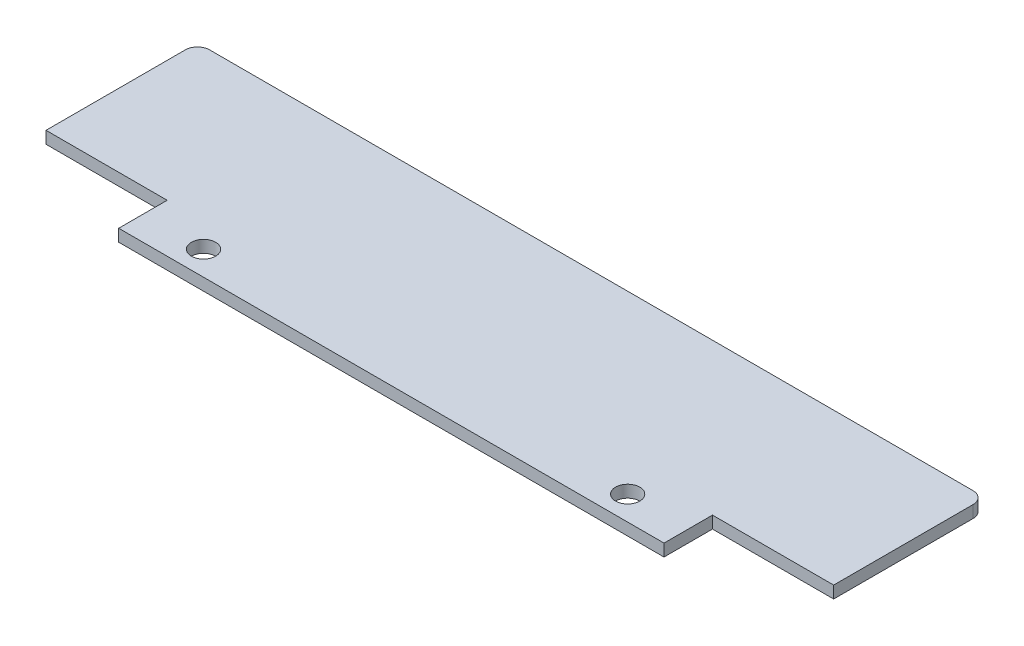
ISO-10303-21;
HEADER;
FILE_DESCRIPTION(('STEP AP214'),'2;1');
FILE_NAME('part.step','',(''),(''),'','','');
FILE_SCHEMA(('AUTOMOTIVE_DESIGN { 1 0 10303 214 1 1 1 1 }'));
ENDSEC;
DATA;
#1=APPLICATION_CONTEXT('core data for automotive mechanical design processes');
#2=APPLICATION_PROTOCOL_DEFINITION('international standard','automotive_design',2000,#1);
#3=PRODUCT_CONTEXT('',#1,'mechanical');
#4=PRODUCT('Part','Part','',(#3));
#5=PRODUCT_RELATED_PRODUCT_CATEGORY('part','',(#4));
#6=PRODUCT_DEFINITION_FORMATION('','',#4);
#7=PRODUCT_DEFINITION_CONTEXT('part definition',#1,'design');
#8=PRODUCT_DEFINITION('design','',#6,#7);
#9=PRODUCT_DEFINITION_SHAPE('','',#8);
#10=(LENGTH_UNIT() NAMED_UNIT(*) SI_UNIT(.MILLI.,.METRE.));
#11=(NAMED_UNIT(*) PLANE_ANGLE_UNIT() SI_UNIT($,.RADIAN.));
#12=(NAMED_UNIT(*) SI_UNIT($,.STERADIAN.) SOLID_ANGLE_UNIT());
#13=UNCERTAINTY_MEASURE_WITH_UNIT(LENGTH_MEASURE(1.E-05),#10,'distance_accuracy_value','');
#14=(GEOMETRIC_REPRESENTATION_CONTEXT(3) GLOBAL_UNCERTAINTY_ASSIGNED_CONTEXT((#13)) GLOBAL_UNIT_ASSIGNED_CONTEXT((#10,
#11,#12)) REPRESENTATION_CONTEXT('',''));
#15=CARTESIAN_POINT('',(0.,0.,0.));
#16=DIRECTION('',(0.,0.,1.));
#17=DIRECTION('',(1.,0.,0.));
#18=AXIS2_PLACEMENT_3D('',#15,#16,#17);
#19=CARTESIAN_POINT('',(0.,2.,0.));
#20=DIRECTION('',(0.,1.,0.));
#21=DIRECTION('',(0.,0.,1.));
#22=AXIS2_PLACEMENT_3D('',#19,#20,#21);
#23=PLANE('',#22);
#24=CARTESIAN_POINT('',(-35.,2.,16.5));
#25=DIRECTION('',(0.,1.,0.));
#26=DIRECTION('',(0.,0.,1.));
#27=AXIS2_PLACEMENT_3D('',#24,#25,#26);
#28=CIRCLE('',#27,2.);
#29=CARTESIAN_POINT('',(-35.,2.,18.5));
#30=VERTEX_POINT('',#29);
#31=EDGE_CURVE('E239',#30,#30,#28,.T.);
#32=ORIENTED_EDGE('',*,*,#31,.F.);
#33=EDGE_LOOP('',(#32));
#34=FACE_BOUND('',#33,.T.);
#35=DIRECTION('',(0.,0.,-1.));
#36=VECTOR('',#35,1.);
#37=CARTESIAN_POINT('',(65.,2.,-12.5));
#38=LINE('',#37,#36);
#39=CARTESIAN_POINT('',(65.,2.,12.5));
#40=VERTEX_POINT('',#39);
#41=CARTESIAN_POINT('',(65.,2.,-10.5));
#42=VERTEX_POINT('',#41);
#43=EDGE_CURVE('E176',#40,#42,#38,.T.);
#44=ORIENTED_EDGE('',*,*,#43,.T.);
#45=CARTESIAN_POINT('',(63.,2.,-10.5));
#46=DIRECTION('',(0.,1.,0.));
#47=DIRECTION('',(0.,0.,1.));
#48=AXIS2_PLACEMENT_3D('',#45,#46,#47);
#49=CIRCLE('',#48,2.);
#50=CARTESIAN_POINT('',(63.,2.,-12.5));
#51=VERTEX_POINT('',#50);
#52=EDGE_CURVE('E52',#42,#51,#49,.T.);
#53=ORIENTED_EDGE('',*,*,#52,.T.);
#54=DIRECTION('',(-1.,0.,0.));
#55=VECTOR('',#54,1.);
#56=CARTESIAN_POINT('',(-65.,2.,-12.5));
#57=LINE('',#56,#55);
#58=CARTESIAN_POINT('',(-63.,2.,-12.5));
#59=VERTEX_POINT('',#58);
#60=EDGE_CURVE('E175',#51,#59,#57,.T.);
#61=ORIENTED_EDGE('',*,*,#60,.T.);
#62=CARTESIAN_POINT('',(-63.,2.,-10.5));
#63=DIRECTION('',(0.,1.,0.));
#64=DIRECTION('',(0.,0.,1.));
#65=AXIS2_PLACEMENT_3D('',#62,#63,#64);
#66=CIRCLE('',#65,2.);
#67=CARTESIAN_POINT('',(-65.,2.,-10.5));
#68=VERTEX_POINT('',#67);
#69=EDGE_CURVE('E59',#59,#68,#66,.T.);
#70=ORIENTED_EDGE('',*,*,#69,.T.);
#71=DIRECTION('',(0.,0.,1.));
#72=VECTOR('',#71,1.);
#73=CARTESIAN_POINT('',(-65.,2.,-12.5));
#74=LINE('',#73,#72);
#75=CARTESIAN_POINT('',(-65.,2.,12.5));
#76=VERTEX_POINT('',#75);
#77=EDGE_CURVE('E139',#68,#76,#74,.T.);
#78=ORIENTED_EDGE('',*,*,#77,.T.);
#79=DIRECTION('',(1.,0.,0.));
#80=VECTOR('',#79,1.);
#81=CARTESIAN_POINT('',(-45.,2.,12.5));
#82=LINE('',#81,#80);
#83=CARTESIAN_POINT('',(-45.,2.,12.5));
#84=VERTEX_POINT('',#83);
#85=EDGE_CURVE('E135',#76,#84,#82,.T.);
#86=ORIENTED_EDGE('',*,*,#85,.T.);
#87=DIRECTION('',(0.,0.,1.));
#88=VECTOR('',#87,1.);
#89=CARTESIAN_POINT('',(-45.,2.,12.5));
#90=LINE('',#89,#88);
#91=CARTESIAN_POINT('',(-45.,2.,20.5));
#92=VERTEX_POINT('',#91);
#93=EDGE_CURVE('E124',#84,#92,#90,.T.);
#94=ORIENTED_EDGE('',*,*,#93,.T.);
#95=DIRECTION('',(1.,0.,0.));
#96=VECTOR('',#95,1.);
#97=CARTESIAN_POINT('',(-45.,2.,20.5));
#98=LINE('',#97,#96);
#99=CARTESIAN_POINT('',(45.,2.,20.5));
#100=VERTEX_POINT('',#99);
#101=EDGE_CURVE('E134',#92,#100,#98,.T.);
#102=ORIENTED_EDGE('',*,*,#101,.T.);
#103=DIRECTION('',(0.,0.,-1.));
#104=VECTOR('',#103,1.);
#105=CARTESIAN_POINT('',(45.,2.,20.5));
#106=LINE('',#105,#104);
#107=CARTESIAN_POINT('',(45.,2.,12.5));
#108=VERTEX_POINT('',#107);
#109=EDGE_CURVE('E226',#100,#108,#106,.T.);
#110=ORIENTED_EDGE('',*,*,#109,.T.);
#111=DIRECTION('',(1.,0.,0.));
#112=VECTOR('',#111,1.);
#113=CARTESIAN_POINT('',(65.,2.,12.5));
#114=LINE('',#113,#112);
#115=EDGE_CURVE('E244',#108,#40,#114,.T.);
#116=ORIENTED_EDGE('',*,*,#115,.T.);
#117=EDGE_LOOP('',(#44,#53,#61,#70,#78,#86,#94,#102,#110,#116));
#118=FACE_BOUND('',#117,.T.);
#119=CARTESIAN_POINT('',(35.,2.,16.5));
#120=DIRECTION('',(0.,1.,0.));
#121=DIRECTION('',(0.,0.,1.));
#122=AXIS2_PLACEMENT_3D('',#119,#120,#121);
#123=CIRCLE('',#122,2.);
#124=CARTESIAN_POINT('',(35.,2.,18.5));
#125=VERTEX_POINT('',#124);
#126=EDGE_CURVE('E255',#125,#125,#123,.T.);
#127=ORIENTED_EDGE('',*,*,#126,.F.);
#128=EDGE_LOOP('',(#127));
#129=FACE_BOUND('',#128,.T.);
#130=ADVANCED_FACE('F43',(#34,#118,#129),#23,.T.);
#131=CARTESIAN_POINT('',(0.,0.,0.));
#132=DIRECTION('',(0.,1.,0.));
#133=DIRECTION('',(0.,0.,1.));
#134=AXIS2_PLACEMENT_3D('',#131,#132,#133);
#135=PLANE('',#134);
#136=DIRECTION('',(-1.,0.,0.));
#137=VECTOR('',#136,1.);
#138=CARTESIAN_POINT('',(-65.,0.,-12.5));
#139=LINE('',#138,#137);
#140=CARTESIAN_POINT('',(63.,0.,-12.5));
#141=VERTEX_POINT('',#140);
#142=CARTESIAN_POINT('',(-63.,0.,-12.5));
#143=VERTEX_POINT('',#142);
#144=EDGE_CURVE('E193',#141,#143,#139,.T.);
#145=ORIENTED_EDGE('',*,*,#144,.F.);
#146=CARTESIAN_POINT('',(63.,0.,-10.5));
#147=DIRECTION('',(0.,1.,0.));
#148=DIRECTION('',(0.,0.,1.));
#149=AXIS2_PLACEMENT_3D('',#146,#147,#148);
#150=CIRCLE('',#149,2.);
#151=CARTESIAN_POINT('',(65.,0.,-10.5));
#152=VERTEX_POINT('',#151);
#153=EDGE_CURVE('E166',#141,#152,#150,.F.);
#154=ORIENTED_EDGE('',*,*,#153,.T.);
#155=DIRECTION('',(0.,0.,-1.));
#156=VECTOR('',#155,1.);
#157=CARTESIAN_POINT('',(65.,0.,-12.5));
#158=LINE('',#157,#156);
#159=CARTESIAN_POINT('',(65.,0.,12.5));
#160=VERTEX_POINT('',#159);
#161=EDGE_CURVE('E192',#160,#152,#158,.T.);
#162=ORIENTED_EDGE('',*,*,#161,.F.);
#163=DIRECTION('',(1.,0.,0.));
#164=VECTOR('',#163,1.);
#165=CARTESIAN_POINT('',(65.,0.,12.5));
#166=LINE('',#165,#164);
#167=CARTESIAN_POINT('',(45.,0.,12.5));
#168=VERTEX_POINT('',#167);
#169=EDGE_CURVE('E199',#168,#160,#166,.T.);
#170=ORIENTED_EDGE('',*,*,#169,.F.);
#171=DIRECTION('',(0.,0.,-1.));
#172=VECTOR('',#171,1.);
#173=CARTESIAN_POINT('',(45.,0.,20.5));
#174=LINE('',#173,#172);
#175=CARTESIAN_POINT('',(45.,0.,20.5));
#176=VERTEX_POINT('',#175);
#177=EDGE_CURVE('E204',#176,#168,#174,.T.);
#178=ORIENTED_EDGE('',*,*,#177,.F.);
#179=DIRECTION('',(1.,0.,0.));
#180=VECTOR('',#179,1.);
#181=CARTESIAN_POINT('',(-45.,0.,20.5));
#182=LINE('',#181,#180);
#183=CARTESIAN_POINT('',(-45.,0.,20.5));
#184=VERTEX_POINT('',#183);
#185=EDGE_CURVE('E229',#184,#176,#182,.T.);
#186=ORIENTED_EDGE('',*,*,#185,.F.);
#187=DIRECTION('',(0.,0.,1.));
#188=VECTOR('',#187,1.);
#189=CARTESIAN_POINT('',(-45.,0.,12.5));
#190=LINE('',#189,#188);
#191=CARTESIAN_POINT('',(-45.,0.,12.5));
#192=VERTEX_POINT('',#191);
#193=EDGE_CURVE('E232',#192,#184,#190,.T.);
#194=ORIENTED_EDGE('',*,*,#193,.F.);
#195=DIRECTION('',(1.,0.,0.));
#196=VECTOR('',#195,1.);
#197=CARTESIAN_POINT('',(-45.,0.,12.5));
#198=LINE('',#197,#196);
#199=CARTESIAN_POINT('',(-65.,0.,12.5));
#200=VERTEX_POINT('',#199);
#201=EDGE_CURVE('E148',#200,#192,#198,.T.);
#202=ORIENTED_EDGE('',*,*,#201,.F.);
#203=DIRECTION('',(0.,0.,1.));
#204=VECTOR('',#203,1.);
#205=CARTESIAN_POINT('',(-65.,0.,-12.5));
#206=LINE('',#205,#204);
#207=CARTESIAN_POINT('',(-65.,0.,-10.5));
#208=VERTEX_POINT('',#207);
#209=EDGE_CURVE('E144',#208,#200,#206,.T.);
#210=ORIENTED_EDGE('',*,*,#209,.F.);
#211=CARTESIAN_POINT('',(-63.,0.,-10.5));
#212=DIRECTION('',(0.,1.,0.));
#213=DIRECTION('',(0.,0.,1.));
#214=AXIS2_PLACEMENT_3D('',#211,#212,#213);
#215=CIRCLE('',#214,2.);
#216=EDGE_CURVE('E163',#208,#143,#215,.F.);
#217=ORIENTED_EDGE('',*,*,#216,.T.);
#218=EDGE_LOOP('',(#145,#154,#162,#170,#178,#186,#194,#202,#210,#217));
#219=FACE_BOUND('',#218,.T.);
#220=CARTESIAN_POINT('',(-35.,0.,16.5));
#221=DIRECTION('',(0.,1.,0.));
#222=DIRECTION('',(0.,0.,1.));
#223=AXIS2_PLACEMENT_3D('',#220,#221,#222);
#224=CIRCLE('',#223,2.);
#225=CARTESIAN_POINT('',(-35.,0.,18.5));
#226=VERTEX_POINT('',#225);
#227=EDGE_CURVE('E251',#226,#226,#224,.T.);
#228=ORIENTED_EDGE('',*,*,#227,.T.);
#229=EDGE_LOOP('',(#228));
#230=FACE_BOUND('',#229,.T.);
#231=CARTESIAN_POINT('',(35.,0.,16.5));
#232=DIRECTION('',(0.,1.,0.));
#233=DIRECTION('',(0.,0.,1.));
#234=AXIS2_PLACEMENT_3D('',#231,#232,#233);
#235=CIRCLE('',#234,2.);
#236=CARTESIAN_POINT('',(35.,0.,18.5));
#237=VERTEX_POINT('',#236);
#238=EDGE_CURVE('E259',#237,#237,#235,.T.);
#239=ORIENTED_EDGE('',*,*,#238,.T.);
#240=EDGE_LOOP('',(#239));
#241=FACE_BOUND('',#240,.T.);
#242=ADVANCED_FACE('F189',(#219,#230,#241),#135,.F.);
#243=CARTESIAN_POINT('',(-45.,2.,12.5));
#244=DIRECTION('',(0.,0.,-1.));
#245=DIRECTION('',(-1.,0.,0.));
#246=AXIS2_PLACEMENT_3D('',#243,#244,#245);
#247=PLANE('',#246);
#248=ORIENTED_EDGE('',*,*,#201,.T.);
#249=DIRECTION('',(0.,-1.,0.));
#250=VECTOR('',#249,1.);
#251=CARTESIAN_POINT('',(-45.,2.,12.5));
#252=LINE('',#251,#250);
#253=EDGE_CURVE('E128',#84,#192,#252,.T.);
#254=ORIENTED_EDGE('',*,*,#253,.F.);
#255=ORIENTED_EDGE('',*,*,#85,.F.);
#256=DIRECTION('',(0.,-1.,0.));
#257=VECTOR('',#256,1.);
#258=CARTESIAN_POINT('',(-65.,2.,12.5));
#259=LINE('',#258,#257);
#260=EDGE_CURVE('E210',#76,#200,#259,.T.);
#261=ORIENTED_EDGE('',*,*,#260,.T.);
#262=EDGE_LOOP('',(#248,#254,#255,#261));
#263=FACE_BOUND('',#262,.T.);
#264=ADVANCED_FACE('F146',(#263),#247,.F.);
#265=CARTESIAN_POINT('',(-45.,2.,12.5));
#266=DIRECTION('',(1.,0.,0.));
#267=DIRECTION('',(0.,0.,-1.));
#268=AXIS2_PLACEMENT_3D('',#265,#266,#267);
#269=PLANE('',#268);
#270=ORIENTED_EDGE('',*,*,#193,.T.);
#271=DIRECTION('',(0.,-1.,0.));
#272=VECTOR('',#271,1.);
#273=CARTESIAN_POINT('',(-45.,2.,20.5));
#274=LINE('',#273,#272);
#275=EDGE_CURVE('E131',#92,#184,#274,.T.);
#276=ORIENTED_EDGE('',*,*,#275,.F.);
#277=ORIENTED_EDGE('',*,*,#93,.F.);
#278=ORIENTED_EDGE('',*,*,#253,.T.);
#279=EDGE_LOOP('',(#270,#276,#277,#278));
#280=FACE_BOUND('',#279,.T.);
#281=ADVANCED_FACE('F126',(#280),#269,.F.);
#282=CARTESIAN_POINT('',(-45.,2.,20.5));
#283=DIRECTION('',(0.,0.,-1.));
#284=DIRECTION('',(-1.,0.,0.));
#285=AXIS2_PLACEMENT_3D('',#282,#283,#284);
#286=PLANE('',#285);
#287=ORIENTED_EDGE('',*,*,#185,.T.);
#288=DIRECTION('',(0.,-1.,0.));
#289=VECTOR('',#288,1.);
#290=CARTESIAN_POINT('',(45.,2.,20.5));
#291=LINE('',#290,#289);
#292=EDGE_CURVE('E156',#100,#176,#291,.T.);
#293=ORIENTED_EDGE('',*,*,#292,.F.);
#294=ORIENTED_EDGE('',*,*,#101,.F.);
#295=ORIENTED_EDGE('',*,*,#275,.T.);
#296=EDGE_LOOP('',(#287,#293,#294,#295));
#297=FACE_BOUND('',#296,.T.);
#298=ADVANCED_FACE('F295',(#297),#286,.F.);
#299=CARTESIAN_POINT('',(45.,2.,20.5));
#300=DIRECTION('',(-1.,0.,0.));
#301=DIRECTION('',(0.,0.,1.));
#302=AXIS2_PLACEMENT_3D('',#299,#300,#301);
#303=PLANE('',#302);
#304=ORIENTED_EDGE('',*,*,#177,.T.);
#305=DIRECTION('',(0.,-1.,0.));
#306=VECTOR('',#305,1.);
#307=CARTESIAN_POINT('',(45.,2.,12.5));
#308=LINE('',#307,#306);
#309=EDGE_CURVE('E215',#108,#168,#308,.T.);
#310=ORIENTED_EDGE('',*,*,#309,.F.);
#311=ORIENTED_EDGE('',*,*,#109,.F.);
#312=ORIENTED_EDGE('',*,*,#292,.T.);
#313=EDGE_LOOP('',(#304,#310,#311,#312));
#314=FACE_BOUND('',#313,.T.);
#315=ADVANCED_FACE('F224',(#314),#303,.F.);
#316=CARTESIAN_POINT('',(65.,2.,12.5));
#317=DIRECTION('',(0.,0.,-1.));
#318=DIRECTION('',(-1.,0.,0.));
#319=AXIS2_PLACEMENT_3D('',#316,#317,#318);
#320=PLANE('',#319);
#321=ORIENTED_EDGE('',*,*,#169,.T.);
#322=DIRECTION('',(0.,-1.,0.));
#323=VECTOR('',#322,1.);
#324=CARTESIAN_POINT('',(65.,2.,12.5));
#325=LINE('',#324,#323);
#326=EDGE_CURVE('E197',#40,#160,#325,.T.);
#327=ORIENTED_EDGE('',*,*,#326,.F.);
#328=ORIENTED_EDGE('',*,*,#115,.F.);
#329=ORIENTED_EDGE('',*,*,#309,.T.);
#330=EDGE_LOOP('',(#321,#327,#328,#329));
#331=FACE_BOUND('',#330,.T.);
#332=ADVANCED_FACE('F289',(#331),#320,.F.);
#333=CARTESIAN_POINT('',(65.,2.,-12.5));
#334=DIRECTION('',(-1.,0.,0.));
#335=DIRECTION('',(0.,0.,1.));
#336=AXIS2_PLACEMENT_3D('',#333,#334,#335);
#337=PLANE('',#336);
#338=ORIENTED_EDGE('',*,*,#161,.T.);
#339=DIRECTION('',(0.,-1.,0.));
#340=VECTOR('',#339,1.);
#341=CARTESIAN_POINT('',(65.,2.,-10.5));
#342=LINE('',#341,#340);
#343=EDGE_CURVE('E67',#152,#42,#342,.F.);
#344=ORIENTED_EDGE('',*,*,#343,.T.);
#345=ORIENTED_EDGE('',*,*,#43,.F.);
#346=ORIENTED_EDGE('',*,*,#326,.T.);
#347=EDGE_LOOP('',(#338,#344,#345,#346));
#348=FACE_BOUND('',#347,.T.);
#349=ADVANCED_FACE('F195',(#348),#337,.F.);
#350=CARTESIAN_POINT('',(-65.,2.,-12.5));
#351=DIRECTION('',(0.,0.,1.));
#352=DIRECTION('',(1.,0.,0.));
#353=AXIS2_PLACEMENT_3D('',#350,#351,#352);
#354=PLANE('',#353);
#355=ORIENTED_EDGE('',*,*,#60,.F.);
#356=DIRECTION('',(0.,-1.,0.));
#357=VECTOR('',#356,1.);
#358=CARTESIAN_POINT('',(63.,2.,-12.5));
#359=LINE('',#358,#357);
#360=EDGE_CURVE('E154',#51,#141,#359,.T.);
#361=ORIENTED_EDGE('',*,*,#360,.T.);
#362=ORIENTED_EDGE('',*,*,#144,.T.);
#363=DIRECTION('',(0.,-1.,0.));
#364=VECTOR('',#363,1.);
#365=CARTESIAN_POINT('',(-63.,2.,-12.5));
#366=LINE('',#365,#364);
#367=EDGE_CURVE('E150',#143,#59,#366,.F.);
#368=ORIENTED_EDGE('',*,*,#367,.T.);
#369=EDGE_LOOP('',(#355,#361,#362,#368));
#370=FACE_BOUND('',#369,.T.);
#371=ADVANCED_FACE('F180',(#370),#354,.F.);
#372=CARTESIAN_POINT('',(-65.,2.,-12.5));
#373=DIRECTION('',(1.,0.,0.));
#374=DIRECTION('',(0.,0.,-1.));
#375=AXIS2_PLACEMENT_3D('',#372,#373,#374);
#376=PLANE('',#375);
#377=ORIENTED_EDGE('',*,*,#77,.F.);
#378=DIRECTION('',(0.,-1.,0.));
#379=VECTOR('',#378,1.);
#380=CARTESIAN_POINT('',(-65.,2.,-10.5));
#381=LINE('',#380,#379);
#382=EDGE_CURVE('E11',#68,#208,#381,.T.);
#383=ORIENTED_EDGE('',*,*,#382,.T.);
#384=ORIENTED_EDGE('',*,*,#209,.T.);
#385=ORIENTED_EDGE('',*,*,#260,.F.);
#386=EDGE_LOOP('',(#377,#383,#384,#385));
#387=FACE_BOUND('',#386,.T.);
#388=ADVANCED_FACE('F281',(#387),#376,.F.);
#389=CARTESIAN_POINT('',(-35.,2.,16.5));
#390=DIRECTION('',(0.,-1.,0.));
#391=DIRECTION('',(0.,0.,-1.));
#392=AXIS2_PLACEMENT_3D('',#389,#390,#391);
#393=CYLINDRICAL_SURFACE('',#392,2.);
#394=ORIENTED_EDGE('',*,*,#31,.T.);
#395=EDGE_LOOP('',(#394));
#396=FACE_BOUND('',#395,.T.);
#397=ORIENTED_EDGE('',*,*,#227,.F.);
#398=EDGE_LOOP('',(#397));
#399=FACE_BOUND('',#398,.T.);
#400=ADVANCED_FACE('F278',(#396,#399),#393,.F.);
#401=CARTESIAN_POINT('',(35.,2.,16.5));
#402=DIRECTION('',(0.,-1.,0.));
#403=DIRECTION('',(0.,0.,-1.));
#404=AXIS2_PLACEMENT_3D('',#401,#402,#403);
#405=CYLINDRICAL_SURFACE('',#404,2.);
#406=ORIENTED_EDGE('',*,*,#126,.T.);
#407=EDGE_LOOP('',(#406));
#408=FACE_BOUND('',#407,.T.);
#409=ORIENTED_EDGE('',*,*,#238,.F.);
#410=EDGE_LOOP('',(#409));
#411=FACE_BOUND('',#410,.T.);
#412=ADVANCED_FACE('F267',(#408,#411),#405,.F.);
#413=CARTESIAN_POINT('',(63.,2.,-10.5));
#414=DIRECTION('',(0.,-1.,0.));
#415=DIRECTION('',(0.,0.,-1.));
#416=AXIS2_PLACEMENT_3D('',#413,#414,#415);
#417=CYLINDRICAL_SURFACE('',#416,2.);
#418=ORIENTED_EDGE('',*,*,#52,.F.);
#419=ORIENTED_EDGE('',*,*,#343,.F.);
#420=ORIENTED_EDGE('',*,*,#153,.F.);
#421=ORIENTED_EDGE('',*,*,#360,.F.);
#422=EDGE_LOOP('',(#418,#419,#420,#421));
#423=FACE_BOUND('',#422,.T.);
#424=ADVANCED_FACE('F186',(#423),#417,.T.);
#425=CARTESIAN_POINT('',(-63.,2.,-10.5));
#426=DIRECTION('',(0.,-1.,0.));
#427=DIRECTION('',(0.,0.,-1.));
#428=AXIS2_PLACEMENT_3D('',#425,#426,#427);
#429=CYLINDRICAL_SURFACE('',#428,2.);
#430=ORIENTED_EDGE('',*,*,#69,.F.);
#431=ORIENTED_EDGE('',*,*,#367,.F.);
#432=ORIENTED_EDGE('',*,*,#216,.F.);
#433=ORIENTED_EDGE('',*,*,#382,.F.);
#434=EDGE_LOOP('',(#430,#431,#432,#433));
#435=FACE_BOUND('',#434,.T.);
#436=ADVANCED_FACE('F45',(#435),#429,.T.);
#437=CLOSED_SHELL('',(#130,#242,#264,#281,#298,#315,#332,#349,#371,#388,#400,#412,#424,#436));
#438=MANIFOLD_SOLID_BREP('B2',#437);
#439=ADVANCED_BREP_SHAPE_REPRESENTATION('',(#18,#438),#14);
#440=SHAPE_DEFINITION_REPRESENTATION(#9,#439);
ENDSEC;
END-ISO-10303-21;
